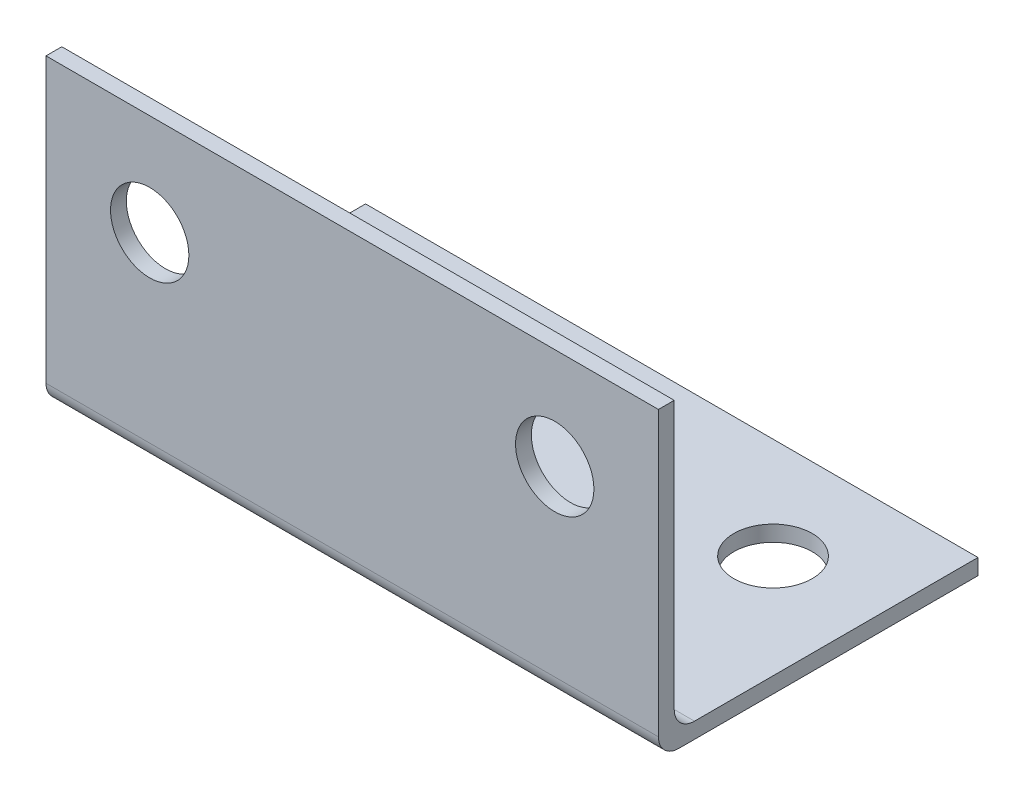
ISO-10303-21;
HEADER;
FILE_DESCRIPTION(('STEP AP214'),'2;1');
FILE_NAME('part.step','',(''),(''),'','','');
FILE_SCHEMA(('AUTOMOTIVE_DESIGN { 1 0 10303 214 1 1 1 1 }'));
ENDSEC;
DATA;
#1=APPLICATION_CONTEXT('core data for automotive mechanical design processes');
#2=APPLICATION_PROTOCOL_DEFINITION('international standard','automotive_design',2000,#1);
#3=PRODUCT_CONTEXT('',#1,'mechanical');
#4=PRODUCT('Part','Part','',(#3));
#5=PRODUCT_RELATED_PRODUCT_CATEGORY('part','',(#4));
#6=PRODUCT_DEFINITION_FORMATION('','',#4);
#7=PRODUCT_DEFINITION_CONTEXT('part definition',#1,'design');
#8=PRODUCT_DEFINITION('design','',#6,#7);
#9=PRODUCT_DEFINITION_SHAPE('','',#8);
#10=(LENGTH_UNIT() NAMED_UNIT(*) SI_UNIT(.MILLI.,.METRE.));
#11=(NAMED_UNIT(*) PLANE_ANGLE_UNIT() SI_UNIT($,.RADIAN.));
#12=(NAMED_UNIT(*) SI_UNIT($,.STERADIAN.) SOLID_ANGLE_UNIT());
#13=UNCERTAINTY_MEASURE_WITH_UNIT(LENGTH_MEASURE(1.E-05),#10,'distance_accuracy_value','');
#14=(GEOMETRIC_REPRESENTATION_CONTEXT(3) GLOBAL_UNCERTAINTY_ASSIGNED_CONTEXT((#13)) GLOBAL_UNIT_ASSIGNED_CONTEXT((#10,
#11,#12)) REPRESENTATION_CONTEXT('',''));
#15=CARTESIAN_POINT('',(0.,0.,0.));
#16=DIRECTION('',(0.,0.,1.));
#17=DIRECTION('',(1.,0.,0.));
#18=AXIS2_PLACEMENT_3D('',#15,#16,#17);
#19=CARTESIAN_POINT('',(0.,0.,0.));
#20=DIRECTION('',(0.,0.,1.));
#21=DIRECTION('',(1.,0.,0.));
#22=AXIS2_PLACEMENT_3D('',#19,#20,#21);
#23=PLANE('',#22);
#24=CARTESIAN_POINT('',(12.7,3.17500000000009,0.));
#25=DIRECTION('',(0.,0.,1.));
#26=DIRECTION('',(1.,0.,0.));
#27=AXIS2_PLACEMENT_3D('',#24,#25,#26);
#28=CIRCLE('',#27,2.45745);
#29=CARTESIAN_POINT('',(15.15745,3.17500000000009,0.));
#30=VERTEX_POINT('',#29);
#31=EDGE_CURVE('E156',#30,#30,#28,.T.);
#32=ORIENTED_EDGE('',*,*,#31,.T.);
#33=EDGE_LOOP('',(#32));
#34=FACE_BOUND('',#33,.T.);
#35=CARTESIAN_POINT('',(-12.7,3.175,0.));
#36=DIRECTION('',(0.,0.,1.));
#37=DIRECTION('',(1.,0.,0.));
#38=AXIS2_PLACEMENT_3D('',#35,#36,#37);
#39=CIRCLE('',#38,2.45745);
#40=CARTESIAN_POINT('',(-10.24255,3.175,0.));
#41=VERTEX_POINT('',#40);
#42=EDGE_CURVE('E148',#41,#41,#39,.T.);
#43=ORIENTED_EDGE('',*,*,#42,.T.);
#44=EDGE_LOOP('',(#43));
#45=FACE_BOUND('',#44,.T.);
#46=DIRECTION('',(0.,1.,0.));
#47=VECTOR('',#46,1.);
#48=CARTESIAN_POINT('',(19.2024,-9.525,0.));
#49=LINE('',#48,#47);
#50=CARTESIAN_POINT('',(19.2024,-7.2644,0.));
#51=VERTEX_POINT('',#50);
#52=CARTESIAN_POINT('',(19.2024,9.525,0.));
#53=VERTEX_POINT('',#52);
#54=EDGE_CURVE('E176',#51,#53,#49,.T.);
#55=ORIENTED_EDGE('',*,*,#54,.F.);
#56=DIRECTION('',(1.,0.,0.));
#57=VECTOR('',#56,1.);
#58=CARTESIAN_POINT('',(-19.2024,-7.2644,0.));
#59=LINE('',#58,#57);
#60=CARTESIAN_POINT('',(-19.2024,-7.2644,0.));
#61=VERTEX_POINT('',#60);
#62=EDGE_CURVE('E193',#51,#61,#59,.F.);
#63=ORIENTED_EDGE('',*,*,#62,.T.);
#64=DIRECTION('',(0.,-1.,0.));
#65=VECTOR('',#64,1.);
#66=CARTESIAN_POINT('',(-19.2024,-9.525,0.));
#67=LINE('',#66,#65);
#68=CARTESIAN_POINT('',(-19.2024,9.525,0.));
#69=VERTEX_POINT('',#68);
#70=EDGE_CURVE('E160',#69,#61,#67,.T.);
#71=ORIENTED_EDGE('',*,*,#70,.F.);
#72=DIRECTION('',(-1.,0.,0.));
#73=VECTOR('',#72,1.);
#74=CARTESIAN_POINT('',(19.2024,9.525,0.));
#75=LINE('',#74,#73);
#76=EDGE_CURVE('E166',#53,#69,#75,.T.);
#77=ORIENTED_EDGE('',*,*,#76,.F.);
#78=EDGE_LOOP('',(#55,#63,#71,#77));
#79=FACE_BOUND('',#78,.T.);
#80=ADVANCED_FACE('F39',(#34,#45,#79),#23,.F.);
#81=CARTESIAN_POINT('',(-19.2024,-9.525,0.9906));
#82=DIRECTION('',(1.,0.,0.));
#83=DIRECTION('',(0.,0.,-1.));
#84=AXIS2_PLACEMENT_3D('',#81,#82,#83);
#85=PLANE('',#84);
#86=DIRECTION('',(0.,0.,-1.));
#87=VECTOR('',#86,1.);
#88=CARTESIAN_POINT('',(-19.2024,-9.525,0.9906));
#89=LINE('',#88,#87);
#90=CARTESIAN_POINT('',(-19.2024,-9.525,-0.2794));
#91=VERTEX_POINT('',#90);
#92=CARTESIAN_POINT('',(-19.2024,-9.525,-19.05));
#93=VERTEX_POINT('',#92);
#94=EDGE_CURVE('E109',#91,#93,#89,.T.);
#95=ORIENTED_EDGE('',*,*,#94,.F.);
#96=CARTESIAN_POINT('',(-19.2024,-8.255,-0.2794));
#97=DIRECTION('',(1.,0.,0.));
#98=DIRECTION('',(0.,0.,-1.));
#99=AXIS2_PLACEMENT_3D('',#96,#97,#98);
#100=CIRCLE('',#99,1.27);
#101=CARTESIAN_POINT('',(-19.2024,-8.255,0.9906));
#102=VERTEX_POINT('',#101);
#103=EDGE_CURVE('E204',#91,#102,#100,.F.);
#104=ORIENTED_EDGE('',*,*,#103,.T.);
#105=DIRECTION('',(0.,-1.,0.));
#106=VECTOR('',#105,1.);
#107=CARTESIAN_POINT('',(-19.2024,-9.525,0.9906));
#108=LINE('',#107,#106);
#109=CARTESIAN_POINT('',(-19.2024,9.525,0.9906));
#110=VERTEX_POINT('',#109);
#111=EDGE_CURVE('E161',#110,#102,#108,.T.);
#112=ORIENTED_EDGE('',*,*,#111,.F.);
#113=DIRECTION('',(0.,0.,-1.));
#114=VECTOR('',#113,1.);
#115=CARTESIAN_POINT('',(-19.2024,9.525,0.9906));
#116=LINE('',#115,#114);
#117=EDGE_CURVE('E172',#110,#69,#116,.T.);
#118=ORIENTED_EDGE('',*,*,#117,.T.);
#119=ORIENTED_EDGE('',*,*,#70,.T.);
#120=CARTESIAN_POINT('',(-19.2024,-7.2644,-1.27));
#121=DIRECTION('',(1.,0.,0.));
#122=DIRECTION('',(0.,0.,-1.));
#123=AXIS2_PLACEMENT_3D('',#120,#121,#122);
#124=CIRCLE('',#123,1.27);
#125=CARTESIAN_POINT('',(-19.2024,-8.5344,-1.27000000000001));
#126=VERTEX_POINT('',#125);
#127=EDGE_CURVE('E11',#61,#126,#124,.T.);
#128=ORIENTED_EDGE('',*,*,#127,.T.);
#129=DIRECTION('',(0.,0.,1.));
#130=VECTOR('',#129,1.);
#131=CARTESIAN_POINT('',(-19.2024,-8.5344,-19.05));
#132=LINE('',#131,#130);
#133=CARTESIAN_POINT('',(-19.2024,-8.5344,-19.05));
#134=VERTEX_POINT('',#133);
#135=EDGE_CURVE('E140',#134,#126,#132,.T.);
#136=ORIENTED_EDGE('',*,*,#135,.F.);
#137=DIRECTION('',(0.,1.,0.));
#138=VECTOR('',#137,1.);
#139=CARTESIAN_POINT('',(-19.2024,-8.5344,-19.05));
#140=LINE('',#139,#138);
#141=EDGE_CURVE('E118',#93,#134,#140,.T.);
#142=ORIENTED_EDGE('',*,*,#141,.F.);
#143=EDGE_LOOP('',(#95,#104,#112,#118,#119,#128,#136,#142));
#144=FACE_BOUND('',#143,.T.);
#145=ADVANCED_FACE('F219',(#144),#85,.F.);
#146=CARTESIAN_POINT('',(19.2024,-9.525,0.9906));
#147=DIRECTION('',(0.,1.,0.));
#148=DIRECTION('',(-1.,0.,0.));
#149=AXIS2_PLACEMENT_3D('',#146,#147,#148);
#150=PLANE('',#149);
#151=CARTESIAN_POINT('',(-12.7,-9.525,-12.7));
#152=DIRECTION('',(0.,1.,0.));
#153=DIRECTION('',(0.,0.,1.));
#154=AXIS2_PLACEMENT_3D('',#151,#152,#153);
#155=CIRCLE('',#154,2.45745);
#156=CARTESIAN_POINT('',(-12.7,-9.525,-10.24255));
#157=VERTEX_POINT('',#156);
#158=EDGE_CURVE('E275',#157,#157,#155,.T.);
#159=ORIENTED_EDGE('',*,*,#158,.T.);
#160=EDGE_LOOP('',(#159));
#161=FACE_BOUND('',#160,.T.);
#162=CARTESIAN_POINT('',(12.7,-9.525,-12.7));
#163=DIRECTION('',(0.,1.,0.));
#164=DIRECTION('',(0.,0.,1.));
#165=AXIS2_PLACEMENT_3D('',#162,#163,#164);
#166=CIRCLE('',#165,2.45745);
#167=CARTESIAN_POINT('',(12.7,-9.525,-10.24255));
#168=VERTEX_POINT('',#167);
#169=EDGE_CURVE('E125',#168,#168,#166,.T.);
#170=ORIENTED_EDGE('',*,*,#169,.T.);
#171=EDGE_LOOP('',(#170));
#172=FACE_BOUND('',#171,.T.);
#173=DIRECTION('',(0.,0.,-1.));
#174=VECTOR('',#173,1.);
#175=CARTESIAN_POINT('',(19.2024,-9.525,0.9906));
#176=LINE('',#175,#174);
#177=CARTESIAN_POINT('',(19.2024,-9.525,-0.2794));
#178=VERTEX_POINT('',#177);
#179=CARTESIAN_POINT('',(19.2024,-9.525,-19.05));
#180=VERTEX_POINT('',#179);
#181=EDGE_CURVE('E102',#178,#180,#176,.T.);
#182=ORIENTED_EDGE('',*,*,#181,.F.);
#183=DIRECTION('',(1.,0.,0.));
#184=VECTOR('',#183,1.);
#185=CARTESIAN_POINT('',(-19.2024,-9.525,-0.2794));
#186=LINE('',#185,#184);
#187=EDGE_CURVE('E55',#178,#91,#186,.F.);
#188=ORIENTED_EDGE('',*,*,#187,.T.);
#189=ORIENTED_EDGE('',*,*,#94,.T.);
#190=DIRECTION('',(-1.,0.,0.));
#191=VECTOR('',#190,1.);
#192=CARTESIAN_POINT('',(19.2024,-9.525,-19.05));
#193=LINE('',#192,#191);
#194=EDGE_CURVE('E113',#180,#93,#193,.T.);
#195=ORIENTED_EDGE('',*,*,#194,.F.);
#196=EDGE_LOOP('',(#182,#188,#189,#195));
#197=FACE_BOUND('',#196,.T.);
#198=ADVANCED_FACE('F114',(#161,#172,#197),#150,.F.);
#199=CARTESIAN_POINT('',(19.2024,-9.525,0.9906));
#200=DIRECTION('',(-1.,0.,0.));
#201=DIRECTION('',(0.,0.,1.));
#202=AXIS2_PLACEMENT_3D('',#199,#200,#201);
#203=PLANE('',#202);
#204=DIRECTION('',(0.,1.,0.));
#205=VECTOR('',#204,1.);
#206=CARTESIAN_POINT('',(19.2024,-9.525,0.9906));
#207=LINE('',#206,#205);
#208=CARTESIAN_POINT('',(19.2024,-8.255,0.9906));
#209=VERTEX_POINT('',#208);
#210=CARTESIAN_POINT('',(19.2024,9.525,0.9906));
#211=VERTEX_POINT('',#210);
#212=EDGE_CURVE('E165',#209,#211,#207,.T.);
#213=ORIENTED_EDGE('',*,*,#212,.F.);
#214=CARTESIAN_POINT('',(19.2024,-8.255,-0.2794));
#215=DIRECTION('',(-1.,0.,0.));
#216=DIRECTION('',(0.,0.,1.));
#217=AXIS2_PLACEMENT_3D('',#214,#215,#216);
#218=CIRCLE('',#217,1.27);
#219=EDGE_CURVE('E63',#209,#178,#218,.F.);
#220=ORIENTED_EDGE('',*,*,#219,.T.);
#221=ORIENTED_EDGE('',*,*,#181,.T.);
#222=DIRECTION('',(0.,-1.,0.));
#223=VECTOR('',#222,1.);
#224=CARTESIAN_POINT('',(19.2024,-8.5344,-19.05));
#225=LINE('',#224,#223);
#226=CARTESIAN_POINT('',(19.2024,-8.5344,-19.05));
#227=VERTEX_POINT('',#226);
#228=EDGE_CURVE('E107',#227,#180,#225,.T.);
#229=ORIENTED_EDGE('',*,*,#228,.F.);
#230=DIRECTION('',(0.,0.,1.));
#231=VECTOR('',#230,1.);
#232=CARTESIAN_POINT('',(19.2024,-8.5344,-19.05));
#233=LINE('',#232,#231);
#234=CARTESIAN_POINT('',(19.2024,-8.5344,-1.27000000000001));
#235=VERTEX_POINT('',#234);
#236=EDGE_CURVE('E137',#227,#235,#233,.T.);
#237=ORIENTED_EDGE('',*,*,#236,.T.);
#238=CARTESIAN_POINT('',(19.2024,-7.2644,-1.27));
#239=DIRECTION('',(-1.,0.,0.));
#240=DIRECTION('',(0.,0.,1.));
#241=AXIS2_PLACEMENT_3D('',#238,#239,#240);
#242=CIRCLE('',#241,1.27);
#243=EDGE_CURVE('E48',#235,#51,#242,.T.);
#244=ORIENTED_EDGE('',*,*,#243,.T.);
#245=ORIENTED_EDGE('',*,*,#54,.T.);
#246=DIRECTION('',(0.,0.,-1.));
#247=VECTOR('',#246,1.);
#248=CARTESIAN_POINT('',(19.2024,9.525,0.9906));
#249=LINE('',#248,#247);
#250=EDGE_CURVE('E110',#211,#53,#249,.T.);
#251=ORIENTED_EDGE('',*,*,#250,.F.);
#252=EDGE_LOOP('',(#213,#220,#221,#229,#237,#244,#245,#251));
#253=FACE_BOUND('',#252,.T.);
#254=ADVANCED_FACE('F104',(#253),#203,.F.);
#255=CARTESIAN_POINT('',(19.2024,9.525,0.9906));
#256=DIRECTION('',(0.,-1.,0.));
#257=DIRECTION('',(1.,0.,0.));
#258=AXIS2_PLACEMENT_3D('',#255,#256,#257);
#259=PLANE('',#258);
#260=ORIENTED_EDGE('',*,*,#76,.T.);
#261=ORIENTED_EDGE('',*,*,#117,.F.);
#262=DIRECTION('',(-1.,0.,0.));
#263=VECTOR('',#262,1.);
#264=CARTESIAN_POINT('',(19.2024,9.525,0.9906));
#265=LINE('',#264,#263);
#266=EDGE_CURVE('E169',#211,#110,#265,.T.);
#267=ORIENTED_EDGE('',*,*,#266,.F.);
#268=ORIENTED_EDGE('',*,*,#250,.T.);
#269=EDGE_LOOP('',(#260,#261,#267,#268));
#270=FACE_BOUND('',#269,.T.);
#271=ADVANCED_FACE('F252',(#270),#259,.F.);
#272=CARTESIAN_POINT('',(0.,0.,0.9906));
#273=DIRECTION('',(0.,0.,1.));
#274=DIRECTION('',(1.,0.,0.));
#275=AXIS2_PLACEMENT_3D('',#272,#273,#274);
#276=PLANE('',#275);
#277=CARTESIAN_POINT('',(-12.7,3.175,0.9906));
#278=DIRECTION('',(0.,0.,1.));
#279=DIRECTION('',(1.,0.,0.));
#280=AXIS2_PLACEMENT_3D('',#277,#278,#279);
#281=CIRCLE('',#280,2.45745);
#282=CARTESIAN_POINT('',(-10.24255,3.175,0.9906));
#283=VERTEX_POINT('',#282);
#284=EDGE_CURVE('E144',#283,#283,#281,.T.);
#285=ORIENTED_EDGE('',*,*,#284,.F.);
#286=EDGE_LOOP('',(#285));
#287=FACE_BOUND('',#286,.T.);
#288=CARTESIAN_POINT('',(12.7,3.17500000000009,0.9906));
#289=DIRECTION('',(0.,0.,1.));
#290=DIRECTION('',(1.,0.,0.));
#291=AXIS2_PLACEMENT_3D('',#288,#289,#290);
#292=CIRCLE('',#291,2.45745);
#293=CARTESIAN_POINT('',(15.15745,3.17500000000009,0.9906));
#294=VERTEX_POINT('',#293);
#295=EDGE_CURVE('E152',#294,#294,#292,.T.);
#296=ORIENTED_EDGE('',*,*,#295,.F.);
#297=EDGE_LOOP('',(#296));
#298=FACE_BOUND('',#297,.T.);
#299=ORIENTED_EDGE('',*,*,#111,.T.);
#300=DIRECTION('',(1.,0.,0.));
#301=VECTOR('',#300,1.);
#302=CARTESIAN_POINT('',(19.2024,-8.255,0.9906));
#303=LINE('',#302,#301);
#304=EDGE_CURVE('E196',#102,#209,#303,.T.);
#305=ORIENTED_EDGE('',*,*,#304,.T.);
#306=ORIENTED_EDGE('',*,*,#212,.T.);
#307=ORIENTED_EDGE('',*,*,#266,.T.);
#308=EDGE_LOOP('',(#299,#305,#306,#307));
#309=FACE_BOUND('',#308,.T.);
#310=ADVANCED_FACE('F250',(#287,#298,#309),#276,.T.);
#311=CARTESIAN_POINT('',(12.7,3.17500000000009,0.9906));
#312=DIRECTION('',(0.,0.,1.));
#313=DIRECTION('',(1.,0.,0.));
#314=AXIS2_PLACEMENT_3D('',#311,#312,#313);
#315=CYLINDRICAL_SURFACE('',#314,2.45745);
#316=ORIENTED_EDGE('',*,*,#31,.F.);
#317=EDGE_LOOP('',(#316));
#318=FACE_BOUND('',#317,.T.);
#319=ORIENTED_EDGE('',*,*,#295,.T.);
#320=EDGE_LOOP('',(#319));
#321=FACE_BOUND('',#320,.T.);
#322=ADVANCED_FACE('F233',(#318,#321),#315,.F.);
#323=CARTESIAN_POINT('',(-12.7,3.175,0.9906));
#324=DIRECTION('',(0.,0.,1.));
#325=DIRECTION('',(1.,0.,0.));
#326=AXIS2_PLACEMENT_3D('',#323,#324,#325);
#327=CYLINDRICAL_SURFACE('',#326,2.45745);
#328=ORIENTED_EDGE('',*,*,#42,.F.);
#329=EDGE_LOOP('',(#328));
#330=FACE_BOUND('',#329,.T.);
#331=ORIENTED_EDGE('',*,*,#284,.T.);
#332=EDGE_LOOP('',(#331));
#333=FACE_BOUND('',#332,.T.);
#334=ADVANCED_FACE('F223',(#330,#333),#327,.F.);
#335=CARTESIAN_POINT('',(19.2024,-8.5344,-19.05));
#336=DIRECTION('',(0.,-1.,0.));
#337=DIRECTION('',(0.,0.,-1.));
#338=AXIS2_PLACEMENT_3D('',#335,#336,#337);
#339=PLANE('',#338);
#340=CARTESIAN_POINT('',(-12.7,-8.5344,-12.7));
#341=DIRECTION('',(0.,1.,0.));
#342=DIRECTION('',(0.,0.,1.));
#343=AXIS2_PLACEMENT_3D('',#340,#341,#342);
#344=CIRCLE('',#343,2.45744999999999);
#345=CARTESIAN_POINT('',(-12.7,-8.5344,-10.24255));
#346=VERTEX_POINT('',#345);
#347=EDGE_CURVE('E277',#346,#346,#344,.T.);
#348=ORIENTED_EDGE('',*,*,#347,.F.);
#349=EDGE_LOOP('',(#348));
#350=FACE_BOUND('',#349,.T.);
#351=CARTESIAN_POINT('',(12.7,-8.5344,-12.7));
#352=DIRECTION('',(0.,1.,0.));
#353=DIRECTION('',(0.,0.,1.));
#354=AXIS2_PLACEMENT_3D('',#351,#352,#353);
#355=CIRCLE('',#354,2.45744999999999);
#356=CARTESIAN_POINT('',(12.7,-8.5344,-10.24255));
#357=VERTEX_POINT('',#356);
#358=EDGE_CURVE('E129',#357,#357,#355,.T.);
#359=ORIENTED_EDGE('',*,*,#358,.F.);
#360=EDGE_LOOP('',(#359));
#361=FACE_BOUND('',#360,.T.);
#362=ORIENTED_EDGE('',*,*,#135,.T.);
#363=DIRECTION('',(1.,0.,0.));
#364=VECTOR('',#363,1.);
#365=CARTESIAN_POINT('',(19.2024,-8.5344,-1.27));
#366=LINE('',#365,#364);
#367=EDGE_CURVE('E189',#126,#235,#366,.T.);
#368=ORIENTED_EDGE('',*,*,#367,.T.);
#369=ORIENTED_EDGE('',*,*,#236,.F.);
#370=DIRECTION('',(1.,0.,0.));
#371=VECTOR('',#370,1.);
#372=CARTESIAN_POINT('',(19.2024,-8.5344,-19.05));
#373=LINE('',#372,#371);
#374=EDGE_CURVE('E122',#134,#227,#373,.T.);
#375=ORIENTED_EDGE('',*,*,#374,.F.);
#376=EDGE_LOOP('',(#362,#368,#369,#375));
#377=FACE_BOUND('',#376,.T.);
#378=ADVANCED_FACE('F221',(#350,#361,#377),#339,.F.);
#379=CARTESIAN_POINT('',(0.,0.,-19.05));
#380=DIRECTION('',(0.,0.,-1.));
#381=DIRECTION('',(-1.,0.,0.));
#382=AXIS2_PLACEMENT_3D('',#379,#380,#381);
#383=PLANE('',#382);
#384=ORIENTED_EDGE('',*,*,#228,.T.);
#385=ORIENTED_EDGE('',*,*,#194,.T.);
#386=ORIENTED_EDGE('',*,*,#141,.T.);
#387=ORIENTED_EDGE('',*,*,#374,.T.);
#388=EDGE_LOOP('',(#384,#385,#386,#387));
#389=FACE_BOUND('',#388,.T.);
#390=ADVANCED_FACE('F120',(#389),#383,.T.);
#391=CARTESIAN_POINT('',(12.7,-8.5344,-12.7));
#392=DIRECTION('',(0.,1.,0.));
#393=DIRECTION('',(0.,0.,1.));
#394=AXIS2_PLACEMENT_3D('',#391,#392,#393);
#395=CYLINDRICAL_SURFACE('',#394,2.45744999999999);
#396=ORIENTED_EDGE('',*,*,#169,.F.);
#397=EDGE_LOOP('',(#396));
#398=FACE_BOUND('',#397,.T.);
#399=ORIENTED_EDGE('',*,*,#358,.T.);
#400=EDGE_LOOP('',(#399));
#401=FACE_BOUND('',#400,.T.);
#402=ADVANCED_FACE('F230',(#398,#401),#395,.F.);
#403=CARTESIAN_POINT('',(-12.7,-8.5344,-12.7));
#404=DIRECTION('',(0.,1.,0.));
#405=DIRECTION('',(0.,0.,1.));
#406=AXIS2_PLACEMENT_3D('',#403,#404,#405);
#407=CYLINDRICAL_SURFACE('',#406,2.45744999999999);
#408=ORIENTED_EDGE('',*,*,#158,.F.);
#409=EDGE_LOOP('',(#408));
#410=FACE_BOUND('',#409,.T.);
#411=ORIENTED_EDGE('',*,*,#347,.T.);
#412=EDGE_LOOP('',(#411));
#413=FACE_BOUND('',#412,.T.);
#414=ADVANCED_FACE('F260',(#410,#413),#407,.F.);
#415=CARTESIAN_POINT('',(19.2024,-7.2644,-1.27));
#416=DIRECTION('',(-1.,0.,0.));
#417=DIRECTION('',(0.,0.,1.));
#418=AXIS2_PLACEMENT_3D('',#415,#416,#417);
#419=CYLINDRICAL_SURFACE('',#418,1.27);
#420=ORIENTED_EDGE('',*,*,#127,.F.);
#421=ORIENTED_EDGE('',*,*,#62,.F.);
#422=ORIENTED_EDGE('',*,*,#243,.F.);
#423=ORIENTED_EDGE('',*,*,#367,.F.);
#424=EDGE_LOOP('',(#420,#421,#422,#423));
#425=FACE_BOUND('',#424,.T.);
#426=ADVANCED_FACE('F216',(#425),#419,.F.);
#427=CARTESIAN_POINT('',(0.,-8.255,-0.2794));
#428=DIRECTION('',(-1.,0.,0.));
#429=DIRECTION('',(0.,-1.,0.));
#430=AXIS2_PLACEMENT_3D('',#427,#428,#429);
#431=CYLINDRICAL_SURFACE('',#430,1.27);
#432=ORIENTED_EDGE('',*,*,#103,.F.);
#433=ORIENTED_EDGE('',*,*,#187,.F.);
#434=ORIENTED_EDGE('',*,*,#219,.F.);
#435=ORIENTED_EDGE('',*,*,#304,.F.);
#436=EDGE_LOOP('',(#432,#433,#434,#435));
#437=FACE_BOUND('',#436,.T.);
#438=ADVANCED_FACE('F41',(#437),#431,.T.);
#439=CLOSED_SHELL('',(#80,#145,#198,#254,#271,#310,#322,#334,#378,#390,#402,#414,#426,#438));
#440=MANIFOLD_SOLID_BREP('B2',#439);
#441=ADVANCED_BREP_SHAPE_REPRESENTATION('',(#18,#440),#14);
#442=SHAPE_DEFINITION_REPRESENTATION(#9,#441);
ENDSEC;
END-ISO-10303-21;
